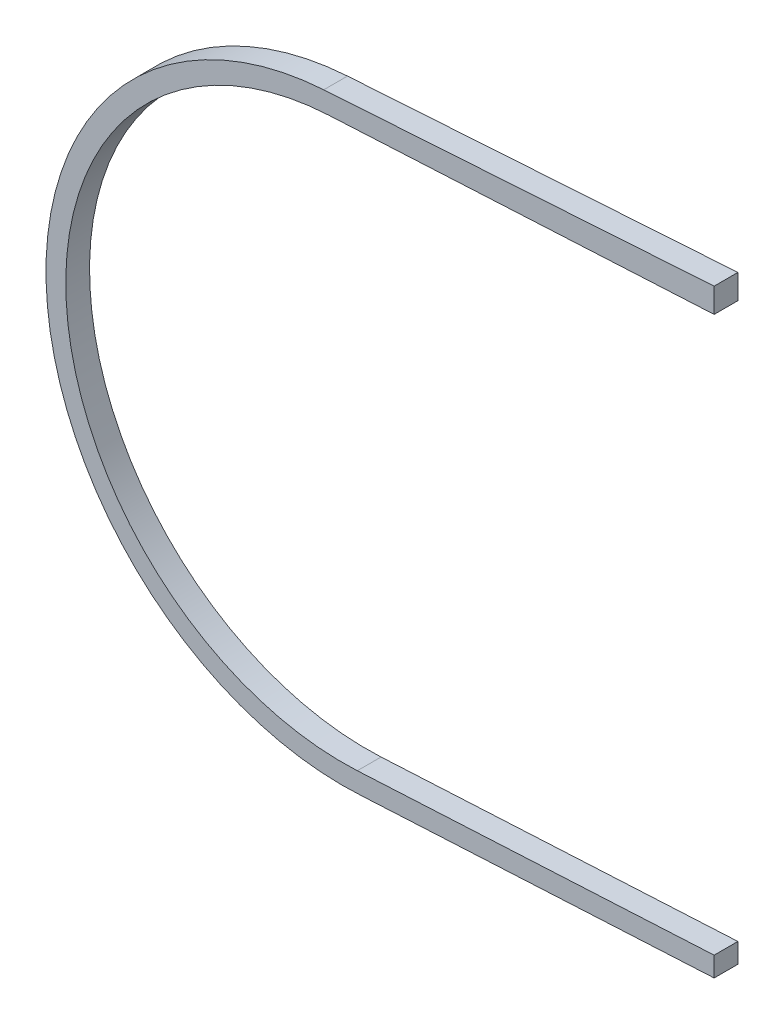
ISO-10303-21;
HEADER;
FILE_DESCRIPTION(('STEP AP214'),'2;1');
FILE_NAME('part.step','',(''),(''),'','','');
FILE_SCHEMA(('AUTOMOTIVE_DESIGN { 1 0 10303 214 1 1 1 1 }'));
ENDSEC;
DATA;
#1=APPLICATION_CONTEXT('core data for automotive mechanical design processes');
#2=APPLICATION_PROTOCOL_DEFINITION('international standard','automotive_design',2000,#1);
#3=PRODUCT_CONTEXT('',#1,'mechanical');
#4=PRODUCT('Part','Part','',(#3));
#5=PRODUCT_RELATED_PRODUCT_CATEGORY('part','',(#4));
#6=PRODUCT_DEFINITION_FORMATION('','',#4);
#7=PRODUCT_DEFINITION_CONTEXT('part definition',#1,'design');
#8=PRODUCT_DEFINITION('design','',#6,#7);
#9=PRODUCT_DEFINITION_SHAPE('','',#8);
#10=(LENGTH_UNIT() NAMED_UNIT(*) SI_UNIT(.MILLI.,.METRE.));
#11=(NAMED_UNIT(*) PLANE_ANGLE_UNIT() SI_UNIT($,.RADIAN.));
#12=(NAMED_UNIT(*) SI_UNIT($,.STERADIAN.) SOLID_ANGLE_UNIT());
#13=UNCERTAINTY_MEASURE_WITH_UNIT(LENGTH_MEASURE(1.E-05),#10,'distance_accuracy_value','');
#14=(GEOMETRIC_REPRESENTATION_CONTEXT(3) GLOBAL_UNCERTAINTY_ASSIGNED_CONTEXT((#13)) GLOBAL_UNIT_ASSIGNED_CONTEXT((#10,
#11,#12)) REPRESENTATION_CONTEXT('',''));
#15=CARTESIAN_POINT('',(0.,0.,0.));
#16=DIRECTION('',(0.,0.,1.));
#17=DIRECTION('',(1.,0.,0.));
#18=AXIS2_PLACEMENT_3D('',#15,#16,#17);
#19=CARTESIAN_POINT('',(0.,0.,6.));
#20=DIRECTION('',(0.,0.,-1.));
#21=DIRECTION('',(-1.,0.,0.));
#22=AXIS2_PLACEMENT_3D('',#19,#20,#21);
#23=CYLINDRICAL_SURFACE('',#22,70.);
#24=CARTESIAN_POINT('',(0.,0.,0.));
#25=DIRECTION('',(0.,0.,-1.));
#26=DIRECTION('',(1.,0.,0.));
#27=AXIS2_PLACEMENT_3D('',#24,#25,#26);
#28=CIRCLE('',#27,70.);
#29=CARTESIAN_POINT('',(3.66189069133089,-69.9041526417762,0.));
#30=VERTEX_POINT('',#29);
#31=CARTESIAN_POINT('',(-3.66189069133089,69.9041526417762,0.));
#32=VERTEX_POINT('',#31);
#33=EDGE_CURVE('E133',#30,#32,#28,.T.);
#34=ORIENTED_EDGE('',*,*,#33,.T.);
#35=DIRECTION('',(0.,0.,-1.));
#36=VECTOR('',#35,1.);
#37=CARTESIAN_POINT('',(-3.66189069133089,69.9041526417762,6.));
#38=LINE('',#37,#36);
#39=CARTESIAN_POINT('',(-3.66189069133089,69.9041526417762,6.));
#40=VERTEX_POINT('',#39);
#41=EDGE_CURVE('E11',#40,#32,#38,.T.);
#42=ORIENTED_EDGE('',*,*,#41,.F.);
#43=CARTESIAN_POINT('',(0.,0.,6.));
#44=DIRECTION('',(0.,0.,-1.));
#45=DIRECTION('',(1.,0.,0.));
#46=AXIS2_PLACEMENT_3D('',#43,#44,#45);
#47=CIRCLE('',#46,70.);
#48=CARTESIAN_POINT('',(3.66189069133089,-69.9041526417762,6.));
#49=VERTEX_POINT('',#48);
#50=EDGE_CURVE('E147',#49,#40,#47,.T.);
#51=ORIENTED_EDGE('',*,*,#50,.F.);
#52=DIRECTION('',(0.,0.,-1.));
#53=VECTOR('',#52,1.);
#54=CARTESIAN_POINT('',(3.66189069133089,-69.9041526417762,6.));
#55=LINE('',#54,#53);
#56=EDGE_CURVE('E129',#49,#30,#55,.T.);
#57=ORIENTED_EDGE('',*,*,#56,.T.);
#58=EDGE_LOOP('',(#34,#42,#51,#57));
#59=FACE_BOUND('',#58,.T.);
#60=ADVANCED_FACE('F37',(#59),#23,.F.);
#61=CARTESIAN_POINT('',(-3.66189069133089,69.9041526417762,6.));
#62=DIRECTION('',(-0.0523127241618699,0.998630752025374,0.));
#63=DIRECTION('',(-0.998630752025374,-0.0523127241618699,0.));
#64=AXIS2_PLACEMENT_3D('',#61,#62,#63);
#65=PLANE('',#64);
#66=DIRECTION('',(0.998630752025374,0.0523127241618699,0.));
#67=VECTOR('',#66,1.);
#68=CARTESIAN_POINT('',(-3.66189069133089,69.9041526417762,0.));
#69=LINE('',#68,#67);
#70=CARTESIAN_POINT('',(93.809651912036,75.0101459345927,0.));
#71=VERTEX_POINT('',#70);
#72=EDGE_CURVE('E136',#32,#71,#69,.T.);
#73=ORIENTED_EDGE('',*,*,#72,.T.);
#74=DIRECTION('',(0.,0.,-1.));
#75=VECTOR('',#74,1.);
#76=CARTESIAN_POINT('',(93.809651912036,75.0101459345927,6.));
#77=LINE('',#76,#75);
#78=CARTESIAN_POINT('',(93.809651912036,75.0101459345927,6.));
#79=VERTEX_POINT('',#78);
#80=EDGE_CURVE('E45',#79,#71,#77,.T.);
#81=ORIENTED_EDGE('',*,*,#80,.F.);
#82=DIRECTION('',(0.998630752025374,0.0523127241618699,0.));
#83=VECTOR('',#82,1.);
#84=CARTESIAN_POINT('',(-3.66189069133089,69.9041526417762,6.));
#85=LINE('',#84,#83);
#86=EDGE_CURVE('E96',#40,#79,#85,.T.);
#87=ORIENTED_EDGE('',*,*,#86,.F.);
#88=ORIENTED_EDGE('',*,*,#41,.T.);
#89=EDGE_LOOP('',(#73,#81,#87,#88));
#90=FACE_BOUND('',#89,.T.);
#91=ADVANCED_FACE('F182',(#90),#65,.F.);
#92=CARTESIAN_POINT('',(93.809651912036,81.2007693094384,6.));
#93=DIRECTION('',(-1.,0.,0.));
#94=DIRECTION('',(0.,0.,1.));
#95=AXIS2_PLACEMENT_3D('',#92,#93,#94);
#96=PLANE('',#95);
#97=DIRECTION('',(0.,1.,0.));
#98=VECTOR('',#97,1.);
#99=CARTESIAN_POINT('',(93.809651912036,81.2007693094384,0.));
#100=LINE('',#99,#98);
#101=CARTESIAN_POINT('',(93.809651912036,81.2007693094384,0.));
#102=VERTEX_POINT('',#101);
#103=EDGE_CURVE('E138',#71,#102,#100,.T.);
#104=ORIENTED_EDGE('',*,*,#103,.T.);
#105=DIRECTION('',(0.,0.,-1.));
#106=VECTOR('',#105,1.);
#107=CARTESIAN_POINT('',(93.809651912036,81.2007693094384,6.));
#108=LINE('',#107,#106);
#109=CARTESIAN_POINT('',(93.809651912036,81.2007693094384,6.));
#110=VERTEX_POINT('',#109);
#111=EDGE_CURVE('E154',#110,#102,#108,.T.);
#112=ORIENTED_EDGE('',*,*,#111,.F.);
#113=DIRECTION('',(0.,1.,0.));
#114=VECTOR('',#113,1.);
#115=CARTESIAN_POINT('',(93.809651912036,81.2007693094384,6.));
#116=LINE('',#115,#114);
#117=EDGE_CURVE('E162',#79,#110,#116,.T.);
#118=ORIENTED_EDGE('',*,*,#117,.F.);
#119=ORIENTED_EDGE('',*,*,#80,.T.);
#120=EDGE_LOOP('',(#104,#112,#118,#119));
#121=FACE_BOUND('',#120,.T.);
#122=ADVANCED_FACE('F160',(#121),#96,.F.);
#123=CARTESIAN_POINT('',(-4.82308531354669,74.844758320528,6.));
#124=DIRECTION('',(0.0643078041806224,-0.997930110940374,0.));
#125=DIRECTION('',(0.997930110940374,0.0643078041806224,0.));
#126=AXIS2_PLACEMENT_3D('',#123,#124,#125);
#127=PLANE('',#126);
#128=DIRECTION('',(-0.997930110940374,-0.0643078041806224,0.));
#129=VECTOR('',#128,1.);
#130=CARTESIAN_POINT('',(-4.82308531354669,74.844758320528,0.));
#131=LINE('',#130,#129);
#132=CARTESIAN_POINT('',(-4.82308531354669,74.844758320528,0.));
#133=VERTEX_POINT('',#132);
#134=EDGE_CURVE('E140',#102,#133,#131,.T.);
#135=ORIENTED_EDGE('',*,*,#134,.T.);
#136=DIRECTION('',(0.,0.,-1.));
#137=VECTOR('',#136,1.);
#138=CARTESIAN_POINT('',(-4.82308531354669,74.844758320528,6.));
#139=LINE('',#138,#137);
#140=CARTESIAN_POINT('',(-4.82308531354669,74.844758320528,6.));
#141=VERTEX_POINT('',#140);
#142=EDGE_CURVE('E151',#141,#133,#139,.T.);
#143=ORIENTED_EDGE('',*,*,#142,.F.);
#144=DIRECTION('',(-0.997930110940374,-0.0643078041806224,0.));
#145=VECTOR('',#144,1.);
#146=CARTESIAN_POINT('',(-4.82308531354669,74.844758320528,6.));
#147=LINE('',#146,#145);
#148=EDGE_CURVE('E174',#110,#141,#147,.T.);
#149=ORIENTED_EDGE('',*,*,#148,.F.);
#150=ORIENTED_EDGE('',*,*,#111,.T.);
#151=EDGE_LOOP('',(#135,#143,#149,#150));
#152=FACE_BOUND('',#151,.T.);
#153=ADVANCED_FACE('F170',(#152),#127,.F.);
#154=CARTESIAN_POINT('',(0.,0.,6.));
#155=DIRECTION('',(0.,0.,-1.));
#156=DIRECTION('',(-1.,0.,0.));
#157=AXIS2_PLACEMENT_3D('',#154,#155,#156);
#158=CYLINDRICAL_SURFACE('',#157,75.);
#159=CARTESIAN_POINT('',(0.,0.,0.));
#160=DIRECTION('',(0.,0.,1.));
#161=DIRECTION('',(1.,0.,0.));
#162=AXIS2_PLACEMENT_3D('',#159,#160,#161);
#163=CIRCLE('',#162,75.);
#164=CARTESIAN_POINT('',(4.82308531354667,-74.844758320528,0.));
#165=VERTEX_POINT('',#164);
#166=EDGE_CURVE('E142',#133,#165,#163,.T.);
#167=ORIENTED_EDGE('',*,*,#166,.T.);
#168=DIRECTION('',(0.,0.,-1.));
#169=VECTOR('',#168,1.);
#170=CARTESIAN_POINT('',(4.82308531354667,-74.844758320528,6.));
#171=LINE('',#170,#169);
#172=CARTESIAN_POINT('',(4.82308531354667,-74.844758320528,6.));
#173=VERTEX_POINT('',#172);
#174=EDGE_CURVE('E124',#173,#165,#171,.T.);
#175=ORIENTED_EDGE('',*,*,#174,.F.);
#176=CARTESIAN_POINT('',(0.,0.,6.));
#177=DIRECTION('',(0.,0.,1.));
#178=DIRECTION('',(1.,0.,0.));
#179=AXIS2_PLACEMENT_3D('',#176,#177,#178);
#180=CIRCLE('',#179,75.);
#181=EDGE_CURVE('E115',#141,#173,#180,.T.);
#182=ORIENTED_EDGE('',*,*,#181,.F.);
#183=ORIENTED_EDGE('',*,*,#142,.T.);
#184=EDGE_LOOP('',(#167,#175,#182,#183));
#185=FACE_BOUND('',#184,.T.);
#186=ADVANCED_FACE('F173',(#185),#158,.T.);
#187=CARTESIAN_POINT('',(4.82308531354669,-74.844758320528,6.));
#188=DIRECTION('',(-0.0523127241618694,0.998630752025374,0.));
#189=DIRECTION('',(-0.998630752025374,-0.0523127241618694,0.));
#190=AXIS2_PLACEMENT_3D('',#187,#188,#189);
#191=PLANE('',#190);
#192=DIRECTION('',(0.998630752025374,0.0523127241618694,0.));
#193=VECTOR('',#192,1.);
#194=CARTESIAN_POINT('',(4.82308531354669,-74.844758320528,0.));
#195=LINE('',#194,#193);
#196=CARTESIAN_POINT('',(93.809651912036,-70.1832458414287,0.));
#197=VERTEX_POINT('',#196);
#198=EDGE_CURVE('E123',#165,#197,#195,.T.);
#199=ORIENTED_EDGE('',*,*,#198,.T.);
#200=DIRECTION('',(0.,0.,-1.));
#201=VECTOR('',#200,1.);
#202=CARTESIAN_POINT('',(93.809651912036,-70.1832458414287,6.));
#203=LINE('',#202,#201);
#204=CARTESIAN_POINT('',(93.809651912036,-70.1832458414287,6.));
#205=VERTEX_POINT('',#204);
#206=EDGE_CURVE('E120',#205,#197,#203,.T.);
#207=ORIENTED_EDGE('',*,*,#206,.F.);
#208=DIRECTION('',(0.998630752025374,0.0523127241618694,0.));
#209=VECTOR('',#208,1.);
#210=CARTESIAN_POINT('',(4.82308531354669,-74.844758320528,6.));
#211=LINE('',#210,#209);
#212=EDGE_CURVE('E109',#173,#205,#211,.T.);
#213=ORIENTED_EDGE('',*,*,#212,.F.);
#214=ORIENTED_EDGE('',*,*,#174,.T.);
#215=EDGE_LOOP('',(#199,#207,#213,#214));
#216=FACE_BOUND('',#215,.T.);
#217=ADVANCED_FACE('F121',(#216),#191,.F.);
#218=CARTESIAN_POINT('',(93.809651912036,-65.1818116193469,6.));
#219=DIRECTION('',(-1.,0.,0.));
#220=DIRECTION('',(0.,0.,1.));
#221=AXIS2_PLACEMENT_3D('',#218,#219,#220);
#222=PLANE('',#221);
#223=DIRECTION('',(0.,1.,0.));
#224=VECTOR('',#223,1.);
#225=CARTESIAN_POINT('',(93.809651912036,-65.1818116193469,0.));
#226=LINE('',#225,#224);
#227=CARTESIAN_POINT('',(93.809651912036,-65.1818116193469,0.));
#228=VERTEX_POINT('',#227);
#229=EDGE_CURVE('E82',#197,#228,#226,.T.);
#230=ORIENTED_EDGE('',*,*,#229,.T.);
#231=DIRECTION('',(0.,0.,-1.));
#232=VECTOR('',#231,1.);
#233=CARTESIAN_POINT('',(93.809651912036,-65.1818116193469,6.));
#234=LINE('',#233,#232);
#235=CARTESIAN_POINT('',(93.809651912036,-65.1818116193469,6.));
#236=VERTEX_POINT('',#235);
#237=EDGE_CURVE('E125',#236,#228,#234,.T.);
#238=ORIENTED_EDGE('',*,*,#237,.F.);
#239=DIRECTION('',(0.,1.,0.));
#240=VECTOR('',#239,1.);
#241=CARTESIAN_POINT('',(93.809651912036,-65.1818116193469,6.));
#242=LINE('',#241,#240);
#243=EDGE_CURVE('E113',#205,#236,#242,.T.);
#244=ORIENTED_EDGE('',*,*,#243,.F.);
#245=ORIENTED_EDGE('',*,*,#206,.T.);
#246=EDGE_LOOP('',(#230,#238,#244,#245));
#247=FACE_BOUND('',#246,.T.);
#248=ADVANCED_FACE('F127',(#247),#222,.F.);
#249=CARTESIAN_POINT('',(3.66189069133089,-69.9041526417762,6.));
#250=DIRECTION('',(0.0523127241618694,-0.998630752025374,0.));
#251=DIRECTION('',(0.998630752025374,0.0523127241618695,0.));
#252=AXIS2_PLACEMENT_3D('',#249,#250,#251);
#253=PLANE('',#252);
#254=DIRECTION('',(-0.998630752025374,-0.0523127241618694,0.));
#255=VECTOR('',#254,1.);
#256=CARTESIAN_POINT('',(3.66189069133089,-69.9041526417762,0.));
#257=LINE('',#256,#255);
#258=EDGE_CURVE('E88',#228,#30,#257,.T.);
#259=ORIENTED_EDGE('',*,*,#258,.T.);
#260=ORIENTED_EDGE('',*,*,#56,.F.);
#261=DIRECTION('',(-0.998630752025374,-0.0523127241618694,0.));
#262=VECTOR('',#261,1.);
#263=CARTESIAN_POINT('',(3.66189069133089,-69.9041526417762,6.));
#264=LINE('',#263,#262);
#265=EDGE_CURVE('E53',#236,#49,#264,.T.);
#266=ORIENTED_EDGE('',*,*,#265,.F.);
#267=ORIENTED_EDGE('',*,*,#237,.T.);
#268=EDGE_LOOP('',(#259,#260,#266,#267));
#269=FACE_BOUND('',#268,.T.);
#270=ADVANCED_FACE('F198',(#269),#253,.F.);
#271=CARTESIAN_POINT('',(0.,0.,6.));
#272=DIRECTION('',(0.,0.,1.));
#273=DIRECTION('',(1.,0.,0.));
#274=AXIS2_PLACEMENT_3D('',#271,#272,#273);
#275=PLANE('',#274);
#276=ORIENTED_EDGE('',*,*,#50,.T.);
#277=ORIENTED_EDGE('',*,*,#86,.T.);
#278=ORIENTED_EDGE('',*,*,#117,.T.);
#279=ORIENTED_EDGE('',*,*,#148,.T.);
#280=ORIENTED_EDGE('',*,*,#181,.T.);
#281=ORIENTED_EDGE('',*,*,#212,.T.);
#282=ORIENTED_EDGE('',*,*,#243,.T.);
#283=ORIENTED_EDGE('',*,*,#265,.T.);
#284=EDGE_LOOP('',(#276,#277,#278,#279,#280,#281,#282,#283));
#285=FACE_BOUND('',#284,.T.);
#286=ADVANCED_FACE('F111',(#285),#275,.T.);
#287=CARTESIAN_POINT('',(0.,0.,0.));
#288=DIRECTION('',(0.,0.,1.));
#289=DIRECTION('',(1.,0.,0.));
#290=AXIS2_PLACEMENT_3D('',#287,#288,#289);
#291=PLANE('',#290);
#292=ORIENTED_EDGE('',*,*,#33,.F.);
#293=ORIENTED_EDGE('',*,*,#258,.F.);
#294=ORIENTED_EDGE('',*,*,#229,.F.);
#295=ORIENTED_EDGE('',*,*,#198,.F.);
#296=ORIENTED_EDGE('',*,*,#166,.F.);
#297=ORIENTED_EDGE('',*,*,#134,.F.);
#298=ORIENTED_EDGE('',*,*,#103,.F.);
#299=ORIENTED_EDGE('',*,*,#72,.F.);
#300=EDGE_LOOP('',(#292,#293,#294,#295,#296,#297,#298,#299));
#301=FACE_BOUND('',#300,.T.);
#302=ADVANCED_FACE('F166',(#301),#291,.F.);
#303=CLOSED_SHELL('',(#60,#91,#122,#153,#186,#217,#248,#270,#286,#302));
#304=MANIFOLD_SOLID_BREP('B2',#303);
#305=ADVANCED_BREP_SHAPE_REPRESENTATION('',(#18,#304),#14);
#306=SHAPE_DEFINITION_REPRESENTATION(#9,#305);
ENDSEC;
END-ISO-10303-21;
